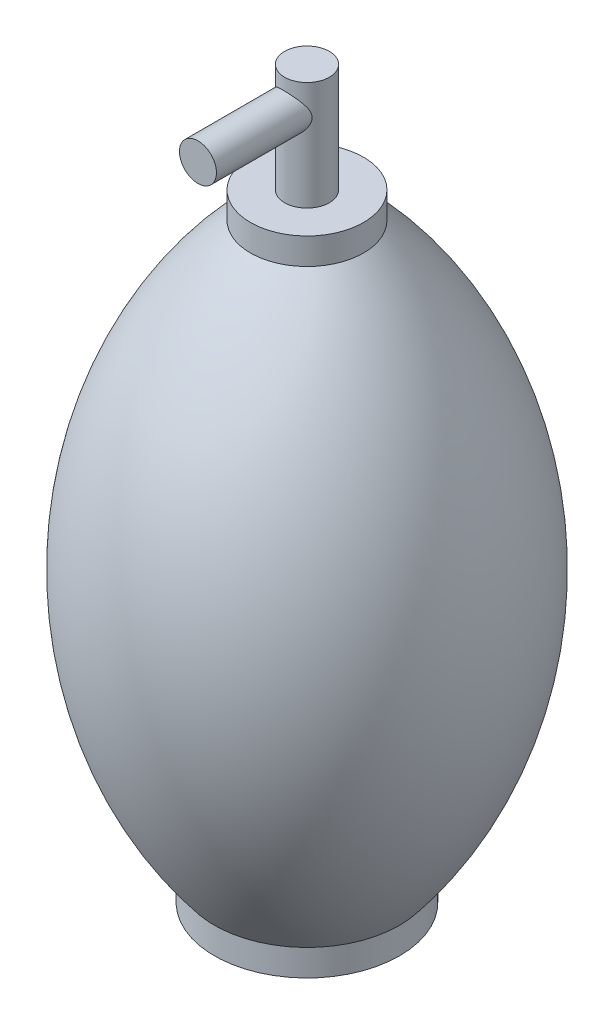
ISO-10303-21;
HEADER;
FILE_DESCRIPTION(('STEP AP214'),'2;1');
FILE_NAME('part.step','',(''),(''),'','','');
FILE_SCHEMA(('AUTOMOTIVE_DESIGN { 1 0 10303 214 1 1 1 1 }'));
ENDSEC;
DATA;
#1=APPLICATION_CONTEXT('core data for automotive mechanical design processes');
#2=APPLICATION_PROTOCOL_DEFINITION('international standard','automotive_design',2000,#1);
#3=PRODUCT_CONTEXT('',#1,'mechanical');
#4=PRODUCT('Part','Part','',(#3));
#5=PRODUCT_RELATED_PRODUCT_CATEGORY('part','',(#4));
#6=PRODUCT_DEFINITION_FORMATION('','',#4);
#7=PRODUCT_DEFINITION_CONTEXT('part definition',#1,'design');
#8=PRODUCT_DEFINITION('design','',#6,#7);
#9=PRODUCT_DEFINITION_SHAPE('','',#8);
#10=(LENGTH_UNIT() NAMED_UNIT(*) SI_UNIT(.MILLI.,.METRE.));
#11=(NAMED_UNIT(*) PLANE_ANGLE_UNIT() SI_UNIT($,.RADIAN.));
#12=(NAMED_UNIT(*) SI_UNIT($,.STERADIAN.) SOLID_ANGLE_UNIT());
#13=UNCERTAINTY_MEASURE_WITH_UNIT(LENGTH_MEASURE(1.E-05),#10,'distance_accuracy_value','');
#14=(GEOMETRIC_REPRESENTATION_CONTEXT(3) GLOBAL_UNCERTAINTY_ASSIGNED_CONTEXT((#13)) GLOBAL_UNIT_ASSIGNED_CONTEXT((#10,
#11,#12)) REPRESENTATION_CONTEXT('',''));
#15=CARTESIAN_POINT('',(0.,0.,0.));
#16=DIRECTION('',(0.,0.,1.));
#17=DIRECTION('',(1.,0.,0.));
#18=AXIS2_PLACEMENT_3D('',#15,#16,#17);
#19=CARTESIAN_POINT('',(-33.1921308702366,51.1188571428569,0.));
#20=DIRECTION('',(0.,-1.,0.));
#21=DIRECTION('',(1.,0.,0.));
#22=AXIS2_PLACEMENT_3D('',#19,#20,#21);
#23=CYLINDRICAL_SURFACE('',#22,7.62141770235588);
#24=CARTESIAN_POINT('',(-33.1921308702366,51.1188571428569,0.));
#25=DIRECTION('',(0.,1.,0.));
#26=DIRECTION('',(-1.,0.,0.));
#27=AXIS2_PLACEMENT_3D('',#24,#25,#26);
#28=CIRCLE('',#27,7.62141770235588);
#29=CARTESIAN_POINT('',(-40.8135485725925,51.1188571428569,0.));
#30=VERTEX_POINT('',#29);
#31=EDGE_CURVE('E70',#30,#30,#28,.T.);
#32=ORIENTED_EDGE('',*,*,#31,.F.);
#33=EDGE_LOOP('',(#32));
#34=FACE_BOUND('',#33,.T.);
#35=CARTESIAN_POINT('',(-33.1921308702366,14.1188571428569,0.));
#36=DIRECTION('',(0.,1.,0.));
#37=DIRECTION('',(-1.,0.,0.));
#38=AXIS2_PLACEMENT_3D('',#35,#36,#37);
#39=CIRCLE('',#38,7.62141770235588);
#40=CARTESIAN_POINT('',(-40.8135485725925,14.1188571428569,0.));
#41=VERTEX_POINT('',#40);
#42=EDGE_CURVE('E58',#41,#41,#39,.T.);
#43=ORIENTED_EDGE('',*,*,#42,.T.);
#44=EDGE_LOOP('',(#43));
#45=FACE_BOUND('',#44,.T.);
#46=CARTESIAN_POINT('',(-39.6067301811328,40.7178846542724,4.11569234448276));
#47=CARTESIAN_POINT('',(-39.6067290736513,40.608548573621,4.11569537905059));
#48=CARTESIAN_POINT('',(-39.603876368673,40.4991864350042,4.12015075800598));
#49=CARTESIAN_POINT('',(-39.5925425880726,40.2814149867204,4.13773387894191));
#50=CARTESIAN_POINT('',(-39.5840580625835,40.1730063023769,4.15086693655856));
#51=CARTESIAN_POINT('',(-39.5616559129648,39.9577783622085,4.18516137514136));
#52=CARTESIAN_POINT('',(-39.5477250947114,39.8509636252482,4.20634224911931));
#53=CARTESIAN_POINT('',(-39.5147330714941,39.6397431367285,4.25577135057583));
#54=CARTESIAN_POINT('',(-39.4956683296648,39.5353390999895,4.28402444930621));
#55=CARTESIAN_POINT('',(-39.4442597677439,39.2886499259925,4.35886243890008));
#56=CARTESIAN_POINT('',(-39.409645503505,39.1476967796038,4.40827971603443));
#57=CARTESIAN_POINT('',(-39.3319175295921,38.8716897382715,4.51590853556148));
#58=CARTESIAN_POINT('',(-39.2888028011706,38.7366365527873,4.57412113184323));
#59=CARTESIAN_POINT('',(-39.1945696717565,38.4719439412031,4.69710050832863));
#60=CARTESIAN_POINT('',(-39.1434282280652,38.3423215064778,4.76188596214025));
#61=CARTESIAN_POINT('',(-39.0336861263079,38.0887003398116,4.89589113228962));
#62=CARTESIAN_POINT('',(-38.9750858454615,37.9647013239044,4.96511062429452));
#63=CARTESIAN_POINT('',(-38.8209042080894,37.6639206710315,5.14025913870641));
#64=CARTESIAN_POINT('',(-38.7210538640355,37.4903053787472,5.24789079192886));
#65=CARTESIAN_POINT('',(-38.5060891361066,37.1542595794511,5.46546336338441));
#66=CARTESIAN_POINT('',(-38.3909677810976,36.9918342323481,5.57540531685101));
#67=CARTESIAN_POINT('',(-38.1457190362867,36.6783689512918,5.79439222931466));
#68=CARTESIAN_POINT('',(-38.0156047750682,36.5273192450465,5.90343788484121));
#69=CARTESIAN_POINT('',(-37.7403150081286,36.2369975751297,6.11804524795498));
#70=CARTESIAN_POINT('',(-37.5951453214936,36.0977210984775,6.22360828097266));
#71=CARTESIAN_POINT('',(-37.3216392768803,35.8596634799561,6.40736774151817));
#72=CARTESIAN_POINT('',(-37.1961179425996,35.758499331192,6.48667573438003));
#73=CARTESIAN_POINT('',(-36.9357300776639,35.5648389657341,6.64035508056937));
#74=CARTESIAN_POINT('',(-36.8008656976877,35.4723407656788,6.7147275623371));
#75=CARTESIAN_POINT('',(-36.5221523457113,35.2969570956194,6.85721747967047));
#76=CARTESIAN_POINT('',(-36.3783148011054,35.2140597683932,6.9253426086751));
#77=CARTESIAN_POINT('',(-36.0819109768344,35.0587455040781,7.05416711793559));
#78=CARTESIAN_POINT('',(-35.9293463536399,34.9863265872513,7.11486790057395));
#79=CARTESIAN_POINT('',(-35.6439570464765,34.864880430012,7.21756897139811));
#80=CARTESIAN_POINT('',(-35.5124325331714,34.8139826322018,7.26097636886091));
#81=CARTESIAN_POINT('',(-35.2444812795552,34.7206348703342,7.34121336535663));
#82=CARTESIAN_POINT('',(-35.1080555579918,34.6781831625596,7.37804432195152));
#83=CARTESIAN_POINT('',(-34.8310330203692,34.6023309149013,7.44448033941398));
#84=CARTESIAN_POINT('',(-34.6904376431569,34.5689272921514,7.47408786111013));
#85=CARTESIAN_POINT('',(-34.4059032094548,34.5116858612109,7.52553406961266));
#86=CARTESIAN_POINT('',(-34.2619641144718,34.4878481632015,7.54737266693549));
#87=CARTESIAN_POINT('',(-33.9711150432073,34.450078467776,7.58292494255326));
#88=CARTESIAN_POINT('',(-33.8241945248595,34.4361920619561,7.59660117802099));
#89=CARTESIAN_POINT('',(-33.5291916865061,34.4187787163162,7.61539503993328));
#90=CARTESIAN_POINT('',(-33.3811093639614,34.4152517991425,7.62051264766832));
#91=CARTESIAN_POINT('',(-33.0850298516963,34.4186499945785,7.62210285147019));
#92=CARTESIAN_POINT('',(-32.9370326564214,34.4255743228979,7.61857609622151));
#93=CARTESIAN_POINT('',(-32.6423487920074,34.4497717045004,7.6029940885688));
#94=CARTESIAN_POINT('',(-32.4956620709408,34.4670443458687,7.59093917562469));
#95=CARTESIAN_POINT('',(-32.2153253814482,34.5100352952401,7.55978019714345));
#96=CARTESIAN_POINT('',(-32.0815023874223,34.5350490208115,7.54125174959803));
#97=CARTESIAN_POINT('',(-31.8167786987501,34.5933882127461,7.49749591706716));
#98=CARTESIAN_POINT('',(-31.6858790063686,34.6267164835251,7.47226627164624));
#99=CARTESIAN_POINT('',(-31.2987462009691,34.7385521466756,7.38720114566388));
#100=CARTESIAN_POINT('',(-31.0478815959459,34.828941487706,7.31796652197931));
#101=CARTESIAN_POINT('',(-30.5460136870343,35.0457085094095,7.15258462783148));
#102=CARTESIAN_POINT('',(-30.2965824842395,35.1743746741853,7.05473634273651));
#103=CARTESIAN_POINT('',(-29.8225453689812,35.4592349369833,6.84102303266507));
#104=CARTESIAN_POINT('',(-29.5979493806767,35.6154399753255,6.72515084952737));
#105=CARTESIAN_POINT('',(-29.1319412222638,35.9855529218715,6.45654176109194));
#106=CARTESIAN_POINT('',(-28.8962772918063,36.2047444212418,6.30108363823937));
#107=CARTESIAN_POINT('',(-28.5713269701335,36.5560065657622,6.06237317716779));
#108=CARTESIAN_POINT('',(-28.4676651598817,36.6769917464431,5.98178669582792));
#109=CARTESIAN_POINT('',(-28.2699256141904,36.9262523514534,5.82015257119474));
#110=CARTESIAN_POINT('',(-28.1758451181874,37.054525659243,5.73910506787717));
#111=CARTESIAN_POINT('',(-27.996454421843,37.3196245451072,5.5772486203377));
#112=CARTESIAN_POINT('',(-27.9112441108573,37.4565243678315,5.49645065585151));
#113=CARTESIAN_POINT('',(-27.750903525772,37.7377865685883,5.33776829738438));
#114=CARTESIAN_POINT('',(-27.6757754221933,37.8821505442838,5.25988453337354));
#115=CARTESIAN_POINT('',(-27.5361390207692,38.1782831766078,5.10943015373876));
#116=CARTESIAN_POINT('',(-27.4716133065039,38.3300391477883,5.03685093555386));
#117=CARTESIAN_POINT('',(-27.3537340104863,38.6412079985053,4.89972435700901));
#118=CARTESIAN_POINT('',(-27.3003737509574,38.8006162308712,4.83517220529107));
#119=CARTESIAN_POINT('',(-27.1924301142469,39.1731794647717,4.70095492927335));
#120=CARTESIAN_POINT('',(-27.141698676157,39.3888723483689,4.63493093993384));
#121=CARTESIAN_POINT('',(-27.0825407012709,39.719974424896,4.55631311397094));
#122=CARTESIAN_POINT('',(-27.0656503189579,39.8315237718067,4.53351878087462));
#123=CARTESIAN_POINT('',(-27.0377996193726,40.056634154712,4.4956391350197));
#124=CARTESIAN_POINT('',(-27.0268363601335,40.1701941637396,4.48054999794281));
#125=CARTESIAN_POINT('',(-27.0110204721221,40.399542536997,4.45870707908766));
#126=CARTESIAN_POINT('',(-27.0062215825028,40.515341682236,4.4520266116001));
#127=CARTESIAN_POINT('',(-27.0030346614957,40.747198092023,4.44759529975037));
#128=CARTESIAN_POINT('',(-27.0046463846159,40.8632553465168,4.44984411344463));
#129=CARTESIAN_POINT('',(-27.0142411756076,41.0946766874678,4.46315496401859));
#130=CARTESIAN_POINT('',(-27.0222289624507,41.2100401967407,4.47422352845001));
#131=CARTESIAN_POINT('',(-27.0443849940013,41.4391151911321,4.50461739153987));
#132=CARTESIAN_POINT('',(-27.0585566307606,41.5528257341187,4.52394722166343));
#133=CARTESIAN_POINT('',(-27.096081975444,41.7995625286549,4.57442512852184));
#134=CARTESIAN_POINT('',(-27.1206802794019,41.9320788842034,4.60713450391158));
#135=CARTESIAN_POINT('',(-27.1776640983459,42.1929893471897,4.68127939066039));
#136=CARTESIAN_POINT('',(-27.2100557751342,42.3213801012266,4.72272180352913));
#137=CARTESIAN_POINT('',(-27.2821426882886,42.5739230895175,4.81262623358496));
#138=CARTESIAN_POINT('',(-27.3218558900612,42.6980639872239,4.86110545391854));
#139=CARTESIAN_POINT('',(-27.4080475283238,42.9416506814903,4.96335195007006));
#140=CARTESIAN_POINT('',(-27.4545241919114,43.0610976980658,5.01711783890236));
#141=CARTESIAN_POINT('',(-27.5794289001367,43.3556093148398,5.15716217157332));
#142=CARTESIAN_POINT('',(-27.6620066309116,43.5277278129529,5.24595542619644));
#143=CARTESIAN_POINT('',(-27.8410802660819,43.8618228650503,5.42850312084038));
#144=CARTESIAN_POINT('',(-27.9375827541217,44.0237945693717,5.52225989426939));
#145=CARTESIAN_POINT('',(-28.1442006691762,44.3379093386354,5.71174970761158));
#146=CARTESIAN_POINT('',(-28.2543316486112,44.4900408672635,5.80748489954625));
#147=CARTESIAN_POINT('',(-28.4879170974843,44.7841216054672,5.9982601677287));
#148=CARTESIAN_POINT('',(-28.6113692509462,44.9260725778807,6.09330036174851));
#149=CARTESIAN_POINT('',(-28.8747059415821,45.2026866709491,6.28273788104657));
#150=CARTESIAN_POINT('',(-29.0149165564461,45.3370893272917,6.37706363160556));
#151=CARTESIAN_POINT('',(-29.309203225974,45.5939169526377,6.56040686281016));
#152=CARTESIAN_POINT('',(-29.4632815585273,45.7163399469625,6.64942346737661));
#153=CARTESIAN_POINT('',(-29.7846162110761,45.9476353052781,6.81966487054131));
#154=CARTESIAN_POINT('',(-29.951837116447,46.0565421751961,6.90090938389316));
#155=CARTESIAN_POINT('',(-30.2992078888787,46.2595749230236,7.05357676578109));
#156=CARTESIAN_POINT('',(-30.4793508135228,46.3537086524853,7.12500484897646));
#157=CARTESIAN_POINT('',(-30.79305925387,46.4984564664287,7.23524644227217));
#158=CARTESIAN_POINT('',(-30.9234970211394,46.5534564584858,7.27725993433431));
#159=CARTESIAN_POINT('',(-31.1894361196662,46.6550571136933,7.35488902528148));
#160=CARTESIAN_POINT('',(-31.3249361146706,46.7016599747452,7.39050629833249));
#161=CARTESIAN_POINT('',(-31.6002700008997,46.7858582271775,7.45466009918673));
#162=CARTESIAN_POINT('',(-31.7401015980148,46.8234582975376,7.48320030539788));
#163=CARTESIAN_POINT('',(-32.0233244169122,46.889145008966,7.5326330472568));
#164=CARTESIAN_POINT('',(-32.1667157471869,46.9172313596953,7.55352534950788));
#165=CARTESIAN_POINT('',(-32.4567423024421,46.9635610675827,7.58726729838261));
#166=CARTESIAN_POINT('',(-32.6033898442563,46.9817562605844,7.60007763826127));
#167=CARTESIAN_POINT('',(-32.8980991213714,47.0077970202879,7.61717386794556));
#168=CARTESIAN_POINT('',(-33.0461608524148,47.0156426181372,7.6214597834058));
#169=CARTESIAN_POINT('',(-33.3424596417166,47.0208660975869,7.62137499812389));
#170=CARTESIAN_POINT('',(-33.4906966918767,47.0182444451584,7.61700468273592));
#171=CARTESIAN_POINT('',(-33.7861097012755,47.0026099680841,7.59967679576754));
#172=CARTESIAN_POINT('',(-33.933285703551,46.9895975673132,7.58671957448058));
#173=CARTESIAN_POINT('',(-34.2147173607369,46.9547683274406,7.55373491240171));
#174=CARTESIAN_POINT('',(-34.3491313277143,46.9336642697982,7.534293244777));
#175=CARTESIAN_POINT('',(-34.6152360825708,46.8830794416188,7.48859216087162));
#176=CARTESIAN_POINT('',(-34.7469259390527,46.8535958552207,7.46233045303742));
#177=CARTESIAN_POINT('',(-35.006764458053,46.7866803363775,7.40343497322431));
#178=CARTESIAN_POINT('',(-35.134914192224,46.7492508397576,7.37080315425416));
#179=CARTESIAN_POINT('',(-35.3871350102783,46.6669116647116,7.29966875753961));
#180=CARTESIAN_POINT('',(-35.5112045502658,46.6219991929412,7.26116398791784));
#181=CARTESIAN_POINT('',(-35.8941691639702,46.4697586573789,7.13167996494127));
#182=CARTESIAN_POINT('',(-36.1449393036833,46.3498033081071,7.03106034624547));
#183=CARTESIAN_POINT('',(-36.6223462628049,46.0825659771884,6.81094233758744));
#184=CARTESIAN_POINT('',(-36.8489647675299,45.9352634864875,6.69142978888299));
#185=CARTESIAN_POINT('',(-37.2215690808945,45.6584850903506,6.47175215455457));
#186=CARTESIAN_POINT('',(-37.3732649097238,45.5342287099476,6.37456065261956));
#187=CARTESIAN_POINT('',(-37.6626625264468,45.2740848135762,6.17504937583285));
#188=CARTESIAN_POINT('',(-37.8003639057985,45.1381969582616,6.07272945139648));
#189=CARTESIAN_POINT('',(-38.0620465282567,44.8553174278198,5.86497253269603));
#190=CARTESIAN_POINT('',(-38.1859967575858,44.7083018624793,5.75952914577948));
#191=CARTESIAN_POINT('',(-38.4198114833948,44.403863179583,5.54816815933888));
#192=CARTESIAN_POINT('',(-38.5296802768239,44.2464432592462,5.44225071473262));
#193=CARTESIAN_POINT('',(-38.7133350301401,43.9557782364466,5.25506073490853));
#194=CARTESIAN_POINT('',(-38.7898232755498,43.8245207609305,5.17334175785542));
#195=CARTESIAN_POINT('',(-38.9338316420426,43.555288760142,5.01303117634102));
#196=CARTESIAN_POINT('',(-39.0013505919714,43.4173133608932,4.93443998122237));
#197=CARTESIAN_POINT('',(-39.1269058076086,43.1346387807789,4.78269028903121));
#198=CARTESIAN_POINT('',(-39.1849627634652,42.9899551838189,4.70952013455951));
#199=CARTESIAN_POINT('',(-39.2911278198681,42.6933995709241,4.5711967791579));
#200=CARTESIAN_POINT('',(-39.3392420231717,42.5415320351912,4.50603867052493));
#201=CARTESIAN_POINT('',(-39.4369511485889,42.1854946735158,4.37002543591881));
#202=CARTESIAN_POINT('',(-39.4830135678637,41.9788157340894,4.30289542153389));
#203=CARTESIAN_POINT('',(-39.5366211493413,41.6613635964301,4.22308876049556));
#204=CARTESIAN_POINT('',(-39.5518995090103,41.5544507411166,4.19998442555325));
#205=CARTESIAN_POINT('',(-39.5770219377115,41.3386071261981,4.16169484121825));
#206=CARTESIAN_POINT('',(-39.58686962163,41.229677758907,4.14650432442846));
#207=CARTESIAN_POINT('',(-39.5981464141126,41.0534218547777,4.12904712326749));
#208=CARTESIAN_POINT('',(-39.601361396778,40.9864658398749,4.12404994787663));
#209=CARTESIAN_POINT('',(-39.6056538542327,40.8523047515255,4.11737126347827));
#210=CARTESIAN_POINT('',(-39.6067308619632,40.7850996268707,4.11569047896507));
#211=CARTESIAN_POINT('',(-39.6067301811328,40.7178846542724,4.11569234448276));
#212=B_SPLINE_CURVE_WITH_KNOTS('',3,(#46,#47,#48,#49,#50,#51,#52,#53,#54,#55,#56,#57,#58,#59,
#60,#61,#62,#63,#64,#65,#66,#67,#68,#69,#70,#71,#72,#73,#74,#75,#76,#77,#78,#79,#80,#81,#82,#83,
#84,#85,#86,#87,#88,#89,#90,#91,#92,#93,#94,#95,#96,#97,#98,#99,#100,#101,#102,#103,#104,#105,
#106,#107,#108,#109,#110,#111,#112,#113,#114,#115,#116,#117,#118,#119,#120,#121,#122,#123,#124,
#125,#126,#127,#128,#129,#130,#131,#132,#133,#134,#135,#136,#137,#138,#139,#140,#141,#142,#143,
#144,#145,#146,#147,#148,#149,#150,#151,#152,#153,#154,#155,#156,#157,#158,#159,#160,#161,#162,
#163,#164,#165,#166,#167,#168,#169,#170,#171,#172,#173,#174,#175,#176,#177,#178,#179,#180,#181,
#182,#183,#184,#185,#186,#187,#188,#189,#190,#191,#192,#193,#194,#195,#196,#197,#198,#199,#200,
#201,#202,#203,#204,#205,#206,#207,#208,#209,#210,#211),.UNSPECIFIED.,.T.,.F.,(4,2,2,2,2,2,2,2,
2,2,2,2,2,2,2,2,2,2,2,2,2,2,2,2,2,2,2,2,2,2,2,2,2,2,2,2,2,2,2,2,2,2,2,2,2,2,2,2,2,2,2,2,2,2,2,2,
2,2,2,2,2,2,2,2,2,2,2,2,2,2,2,2,2,2,2,2,2,2,2,2,2,2,4),(0.,0.327929018274589,0.656059100617243,
0.984989082538287,1.31414625338141,1.77336024506389,2.23262930523954,2.69324177657956,
3.15383096236931,3.83503372913498,4.51654853834031,5.19747104824774,5.87813134815649,
6.41665740495832,6.95505990754409,7.49279021974344,8.03041880285242,8.47266095729891,
8.91481171474568,9.3568116324145,9.79881664093465,10.2428339581205,10.6868522459467,
11.1308372150712,11.5748045125452,11.9865240959216,12.3983827365398,13.2215023284701,
14.1100102228099,14.9988718917981,16.0670512835273,16.6023725675341,17.1375391760785,
17.6781967187592,18.2189704693535,18.7588468189133,19.2983993533036,19.9892329377259,
20.3341806051617,20.6789568979804,21.0267188931327,21.3744675709939,21.7224738591056,
22.0706712809318,22.4861022976134,22.9018628589982,23.3186575217853,23.7353431265619,
24.3660568844404,24.9970698277391,25.6288096217678,26.2604397599789,26.9073984192452,
27.5544635415349,28.1998411899849,28.8448746663069,29.287448267312,29.7299058583675,
30.1721329913555,30.614373618988,31.0587488379106,31.5031227194662,31.947476819031,
32.3918127927719,32.803682588855,33.2156909538571,33.6275731992765,34.0396095434669,
34.9229907802585,35.8070372068799,36.4627909900911,37.1185639113258,37.775786993628,
38.4328090444229,38.9499638906787,39.4671861975276,39.9832618845432,40.4990198626529,
41.1626888510892,41.4936657974103,41.8244221647977,42.0259743534401,42.2275705680309),.UNSPECIFIED.);
#213=CARTESIAN_POINT('',(-39.6067301811328,40.7178846542724,4.11569234448276));
#214=VERTEX_POINT('',#213);
#215=EDGE_CURVE('E12',#214,#214,#212,.T.);
#216=ORIENTED_EDGE('',*,*,#215,.F.);
#217=EDGE_LOOP('',(#216));
#218=FACE_BOUND('',#217,.T.);
#219=ADVANCED_FACE('F46',(#34,#45,#218),#23,.T.);
#220=CARTESIAN_POINT('',(-33.1921308702366,5.11885714285692,0.));
#221=DIRECTION('',(0.,1.,0.));
#222=DIRECTION('',(-1.,0.,0.));
#223=AXIS2_PLACEMENT_3D('',#220,#221,#222);
#224=CYLINDRICAL_SURFACE('',#223,19.25);
#225=CARTESIAN_POINT('',(-33.1921308702366,14.1188571428569,0.));
#226=DIRECTION('',(0.,1.,0.));
#227=DIRECTION('',(-1.,0.,0.));
#228=AXIS2_PLACEMENT_3D('',#225,#226,#227);
#229=CIRCLE('',#228,19.25);
#230=CARTESIAN_POINT('',(-52.4421308702366,14.1188571428569,0.));
#231=VERTEX_POINT('',#230);
#232=EDGE_CURVE('E72',#231,#231,#229,.T.);
#233=ORIENTED_EDGE('',*,*,#232,.F.);
#234=EDGE_LOOP('',(#233));
#235=FACE_BOUND('',#234,.T.);
#236=CARTESIAN_POINT('',(-33.1921308702366,5.11885714285696,0.));
#237=DIRECTION('',(0.,1.,0.));
#238=DIRECTION('',(-1.,0.,0.));
#239=AXIS2_PLACEMENT_3D('',#236,#237,#238);
#240=CIRCLE('',#239,19.25);
#241=CARTESIAN_POINT('',(-52.4421308702366,5.11885714285696,0.));
#242=VERTEX_POINT('',#241);
#243=EDGE_CURVE('E62',#242,#242,#240,.T.);
#244=ORIENTED_EDGE('',*,*,#243,.T.);
#245=EDGE_LOOP('',(#244));
#246=FACE_BOUND('',#245,.T.);
#247=ADVANCED_FACE('F48',(#235,#246),#224,.T.);
#248=CARTESIAN_POINT('',(-33.1921308702366,-97.6482453052351,0.));
#249=DIRECTION('',(0.,1.,0.));
#250=DIRECTION('',(-1.,0.,0.));
#251=AXIS2_PLACEMENT_3D('',#248,#249,#250);
#252=DEGENERATE_TOROIDAL_SURFACE('',#251,80.6889730639731,143.348790307621,.F.);
#253=ORIENTED_EDGE('',*,*,#243,.F.);
#254=EDGE_LOOP('',(#253));
#255=FACE_BOUND('',#254,.T.);
#256=CARTESIAN_POINT('',(-33.1921308702366,-186.881142857143,0.));
#257=DIRECTION('',(0.,1.,0.));
#258=DIRECTION('',(-1.,0.,0.));
#259=AXIS2_PLACEMENT_3D('',#256,#257,#258);
#260=CIRCLE('',#259,31.5);
#261=CARTESIAN_POINT('',(-64.6921308702366,-186.881142857143,0.));
#262=VERTEX_POINT('',#261);
#263=EDGE_CURVE('E67',#262,#262,#260,.T.);
#264=ORIENTED_EDGE('',*,*,#263,.T.);
#265=EDGE_LOOP('',(#264));
#266=FACE_BOUND('',#265,.T.);
#267=ADVANCED_FACE('F81',(#255,#266),#252,.F.);
#268=CARTESIAN_POINT('',(-33.1921308702366,5.11885714285692,0.));
#269=DIRECTION('',(0.,1.,0.));
#270=DIRECTION('',(-1.,0.,0.));
#271=AXIS2_PLACEMENT_3D('',#268,#269,#270);
#272=CYLINDRICAL_SURFACE('',#271,31.5);
#273=ORIENTED_EDGE('',*,*,#263,.F.);
#274=EDGE_LOOP('',(#273));
#275=FACE_BOUND('',#274,.T.);
#276=CARTESIAN_POINT('',(-33.1921308702366,-195.881142857143,0.));
#277=DIRECTION('',(0.,1.,0.));
#278=DIRECTION('',(-1.,0.,0.));
#279=AXIS2_PLACEMENT_3D('',#276,#277,#278);
#280=CIRCLE('',#279,31.5);
#281=CARTESIAN_POINT('',(-64.6921308702366,-195.881142857143,0.));
#282=VERTEX_POINT('',#281);
#283=EDGE_CURVE('E75',#282,#282,#280,.T.);
#284=ORIENTED_EDGE('',*,*,#283,.T.);
#285=EDGE_LOOP('',(#284));
#286=FACE_BOUND('',#285,.T.);
#287=ADVANCED_FACE('F83',(#275,#286),#272,.T.);
#288=CARTESIAN_POINT('',(-33.1921308702366,-195.881142857143,0.));
#289=DIRECTION('',(0.,1.,0.));
#290=DIRECTION('',(-1.,0.,0.));
#291=AXIS2_PLACEMENT_3D('',#288,#289,#290);
#292=PLANE('',#291);
#293=ORIENTED_EDGE('',*,*,#283,.F.);
#294=EDGE_LOOP('',(#293));
#295=FACE_BOUND('',#294,.T.);
#296=ADVANCED_FACE('F86',(#295),#292,.F.);
#297=CARTESIAN_POINT('',(-13.9421308702366,14.1188571428569,0.));
#298=DIRECTION('',(0.,-1.,0.));
#299=DIRECTION('',(1.,0.,0.));
#300=AXIS2_PLACEMENT_3D('',#297,#298,#299);
#301=PLANE('',#300);
#302=ORIENTED_EDGE('',*,*,#42,.F.);
#303=EDGE_LOOP('',(#302));
#304=FACE_BOUND('',#303,.T.);
#305=ORIENTED_EDGE('',*,*,#232,.T.);
#306=EDGE_LOOP('',(#305));
#307=FACE_BOUND('',#306,.T.);
#308=ADVANCED_FACE('F91',(#304,#307),#301,.F.);
#309=CARTESIAN_POINT('',(-33.1921308702366,51.1188571428569,0.));
#310=DIRECTION('',(0.,1.,0.));
#311=DIRECTION('',(-1.,0.,0.));
#312=AXIS2_PLACEMENT_3D('',#309,#310,#311);
#313=PLANE('',#312);
#314=ORIENTED_EDGE('',*,*,#31,.T.);
#315=EDGE_LOOP('',(#314));
#316=FACE_BOUND('',#315,.T.);
#317=ADVANCED_FACE('F96',(#316),#313,.T.);
#318=CARTESIAN_POINT('',(-33.3053814981344,40.7178846542724,37.));
#319=DIRECTION('',(0.,0.,-1.));
#320=DIRECTION('',(-1.,0.,0.));
#321=AXIS2_PLACEMENT_3D('',#318,#319,#320);
#322=CYLINDRICAL_SURFACE('',#321,6.3013486829984);
#323=CARTESIAN_POINT('',(-33.3053814981344,40.7178846542724,37.));
#324=DIRECTION('',(0.,0.,1.));
#325=DIRECTION('',(1.,0.,0.));
#326=AXIS2_PLACEMENT_3D('',#323,#324,#325);
#327=CIRCLE('',#326,6.3013486829984);
#328=CARTESIAN_POINT('',(-27.004032815136,40.7178846542724,37.));
#329=VERTEX_POINT('',#328);
#330=EDGE_CURVE('E122',#329,#329,#327,.T.);
#331=ORIENTED_EDGE('',*,*,#330,.F.);
#332=EDGE_LOOP('',(#331));
#333=FACE_BOUND('',#332,.T.);
#334=ORIENTED_EDGE('',*,*,#215,.T.);
#335=EDGE_LOOP('',(#334));
#336=FACE_BOUND('',#335,.T.);
#337=ADVANCED_FACE('F109',(#333,#336),#322,.T.);
#338=CARTESIAN_POINT('',(-33.3053814981344,40.7178846542724,37.));
#339=DIRECTION('',(0.,0.,1.));
#340=DIRECTION('',(1.,0.,0.));
#341=AXIS2_PLACEMENT_3D('',#338,#339,#340);
#342=PLANE('',#341);
#343=ORIENTED_EDGE('',*,*,#330,.T.);
#344=EDGE_LOOP('',(#343));
#345=FACE_BOUND('',#344,.T.);
#346=ADVANCED_FACE('F114',(#345),#342,.T.);
#347=CLOSED_SHELL('',(#219,#247,#267,#287,#296,#308,#317,#337,#346));
#348=MANIFOLD_SOLID_BREP('B2',#347);
#349=ADVANCED_BREP_SHAPE_REPRESENTATION('',(#18,#348),#14);
#350=SHAPE_DEFINITION_REPRESENTATION(#9,#349);
ENDSEC;
END-ISO-10303-21;
